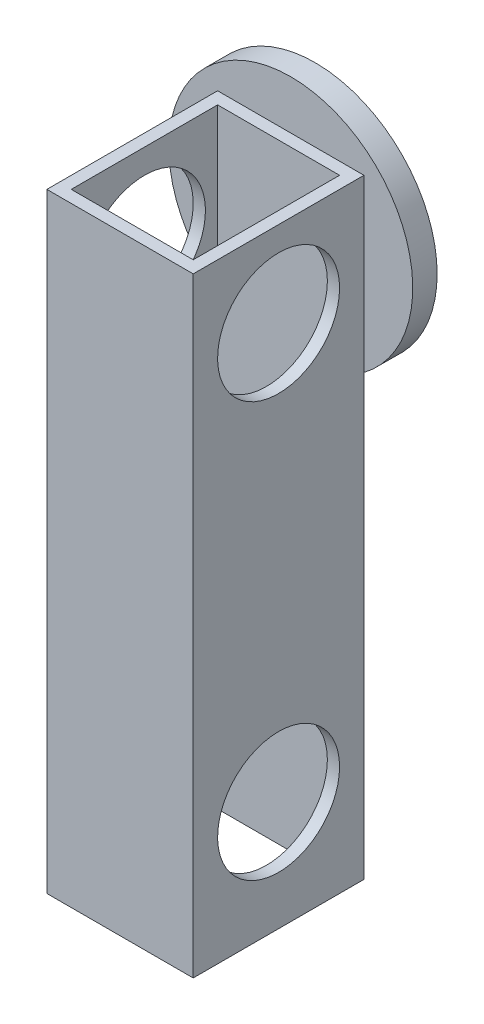
ISO-10303-21;
HEADER;
FILE_DESCRIPTION(('STEP AP214'),'2;1');
FILE_NAME('part.step','',(''),(''),'','','');
FILE_SCHEMA(('AUTOMOTIVE_DESIGN { 1 0 10303 214 1 1 1 1 }'));
ENDSEC;
DATA;
#1=APPLICATION_CONTEXT('core data for automotive mechanical design processes');
#2=APPLICATION_PROTOCOL_DEFINITION('international standard','automotive_design',2000,#1);
#3=PRODUCT_CONTEXT('',#1,'mechanical');
#4=PRODUCT('Part','Part','',(#3));
#5=PRODUCT_RELATED_PRODUCT_CATEGORY('part','',(#4));
#6=PRODUCT_DEFINITION_FORMATION('','',#4);
#7=PRODUCT_DEFINITION_CONTEXT('part definition',#1,'design');
#8=PRODUCT_DEFINITION('design','',#6,#7);
#9=PRODUCT_DEFINITION_SHAPE('','',#8);
#10=(LENGTH_UNIT() NAMED_UNIT(*) SI_UNIT(.MILLI.,.METRE.));
#11=(NAMED_UNIT(*) PLANE_ANGLE_UNIT() SI_UNIT($,.RADIAN.));
#12=(NAMED_UNIT(*) SI_UNIT($,.STERADIAN.) SOLID_ANGLE_UNIT());
#13=UNCERTAINTY_MEASURE_WITH_UNIT(LENGTH_MEASURE(1.E-05),#10,'distance_accuracy_value','');
#14=(GEOMETRIC_REPRESENTATION_CONTEXT(3) GLOBAL_UNCERTAINTY_ASSIGNED_CONTEXT((#13)) GLOBAL_UNIT_ASSIGNED_CONTEXT((#10,
#11,#12)) REPRESENTATION_CONTEXT('',''));
#15=CARTESIAN_POINT('',(0.,0.,0.));
#16=DIRECTION('',(0.,0.,1.));
#17=DIRECTION('',(1.,0.,0.));
#18=AXIS2_PLACEMENT_3D('',#15,#16,#17);
#19=CARTESIAN_POINT('',(160.,-175.,45.));
#20=DIRECTION('',(-1.,0.,0.));
#21=DIRECTION('',(0.,-1.,0.));
#22=AXIS2_PLACEMENT_3D('',#19,#20,#21);
#23=CYLINDRICAL_SURFACE('',#22,25.);
#24=CARTESIAN_POINT('',(-25.,-175.,45.));
#25=DIRECTION('',(-1.,0.,0.));
#26=DIRECTION('',(0.,0.,1.));
#27=AXIS2_PLACEMENT_3D('',#24,#25,#26);
#28=CIRCLE('',#27,25.);
#29=CARTESIAN_POINT('',(-25.,-175.,70.));
#30=VERTEX_POINT('',#29);
#31=EDGE_CURVE('E155',#30,#30,#28,.F.);
#32=ORIENTED_EDGE('',*,*,#31,.T.);
#33=EDGE_LOOP('',(#32));
#34=FACE_BOUND('',#33,.T.);
#35=CARTESIAN_POINT('',(-30.,-175.,45.));
#36=DIRECTION('',(-1.,0.,0.));
#37=DIRECTION('',(0.,-1.,0.));
#38=AXIS2_PLACEMENT_3D('',#35,#36,#37);
#39=CIRCLE('',#38,25.);
#40=CARTESIAN_POINT('',(-30.,-200.,45.));
#41=VERTEX_POINT('',#40);
#42=EDGE_CURVE('E168',#41,#41,#39,.T.);
#43=ORIENTED_EDGE('',*,*,#42,.T.);
#44=EDGE_LOOP('',(#43));
#45=FACE_BOUND('',#44,.T.);
#46=ADVANCED_FACE('F38',(#34,#45),#23,.F.);
#47=CARTESIAN_POINT('',(160.,-4.99999999999998,45.));
#48=DIRECTION('',(-1.,0.,0.));
#49=DIRECTION('',(0.,-1.,0.));
#50=AXIS2_PLACEMENT_3D('',#47,#48,#49);
#51=CYLINDRICAL_SURFACE('',#50,25.);
#52=CARTESIAN_POINT('',(-25.,-5.,45.));
#53=DIRECTION('',(-1.,0.,0.));
#54=DIRECTION('',(0.,0.,1.));
#55=AXIS2_PLACEMENT_3D('',#52,#53,#54);
#56=CIRCLE('',#55,25.);
#57=CARTESIAN_POINT('',(-25.,-5.,70.));
#58=VERTEX_POINT('',#57);
#59=EDGE_CURVE('E42',#58,#58,#56,.F.);
#60=ORIENTED_EDGE('',*,*,#59,.T.);
#61=EDGE_LOOP('',(#60));
#62=FACE_BOUND('',#61,.T.);
#63=CARTESIAN_POINT('',(-30.,-5.,45.));
#64=DIRECTION('',(-1.,0.,0.));
#65=DIRECTION('',(0.,-1.,0.));
#66=AXIS2_PLACEMENT_3D('',#63,#64,#65);
#67=CIRCLE('',#66,25.);
#68=CARTESIAN_POINT('',(-30.,-30.,45.));
#69=VERTEX_POINT('',#68);
#70=EDGE_CURVE('E169',#69,#69,#67,.T.);
#71=ORIENTED_EDGE('',*,*,#70,.T.);
#72=EDGE_LOOP('',(#71));
#73=FACE_BOUND('',#72,.T.);
#74=ADVANCED_FACE('F290',(#62,#73),#51,.F.);
#75=CARTESIAN_POINT('',(0.,0.,10.));
#76=DIRECTION('',(0.,0.,1.));
#77=DIRECTION('',(1.,0.,0.));
#78=AXIS2_PLACEMENT_3D('',#75,#76,#77);
#79=PLANE('',#78);
#80=CARTESIAN_POINT('',(0.,0.,10.));
#81=DIRECTION('',(0.,0.,1.));
#82=DIRECTION('',(1.,0.,0.));
#83=AXIS2_PLACEMENT_3D('',#80,#81,#82);
#84=CIRCLE('',#83,50.);
#85=CARTESIAN_POINT('',(30.,-40.,10.));
#86=VERTEX_POINT('',#85);
#87=CARTESIAN_POINT('',(-30.,-40.,10.));
#88=VERTEX_POINT('',#87);
#89=EDGE_CURVE('E48',#86,#88,#84,.T.);
#90=ORIENTED_EDGE('',*,*,#89,.T.);
#91=DIRECTION('',(0.,-1.,0.));
#92=VECTOR('',#91,1.);
#93=CARTESIAN_POINT('',(-30.,30.,10.));
#94=LINE('',#93,#92);
#95=CARTESIAN_POINT('',(-30.,30.,10.));
#96=VERTEX_POINT('',#95);
#97=EDGE_CURVE('E212',#96,#88,#94,.T.);
#98=ORIENTED_EDGE('',*,*,#97,.F.);
#99=DIRECTION('',(1.,0.,0.));
#100=VECTOR('',#99,1.);
#101=CARTESIAN_POINT('',(-30.,30.,10.));
#102=LINE('',#101,#100);
#103=CARTESIAN_POINT('',(30.,30.,10.));
#104=VERTEX_POINT('',#103);
#105=EDGE_CURVE('E222',#96,#104,#102,.T.);
#106=ORIENTED_EDGE('',*,*,#105,.T.);
#107=DIRECTION('',(0.,-1.,0.));
#108=VECTOR('',#107,1.);
#109=CARTESIAN_POINT('',(30.,30.,10.));
#110=LINE('',#109,#108);
#111=EDGE_CURVE('E207',#104,#86,#110,.T.);
#112=ORIENTED_EDGE('',*,*,#111,.T.);
#113=EDGE_LOOP('',(#90,#98,#106,#112));
#114=FACE_BOUND('',#113,.T.);
#115=ADVANCED_FACE('F271',(#114),#79,.T.);
#116=CARTESIAN_POINT('',(0.,0.,10.));
#117=DIRECTION('',(0.,0.,-1.));
#118=DIRECTION('',(-1.,0.,0.));
#119=AXIS2_PLACEMENT_3D('',#116,#117,#118);
#120=CYLINDRICAL_SURFACE('',#119,50.);
#121=EDGE_CURVE('E11',#88,#86,#84,.T.);
#122=ORIENTED_EDGE('',*,*,#121,.F.);
#123=ORIENTED_EDGE('',*,*,#89,.F.);
#124=EDGE_LOOP('',(#122,#123));
#125=FACE_BOUND('',#124,.T.);
#126=CARTESIAN_POINT('',(0.,0.,0.));
#127=DIRECTION('',(0.,0.,1.));
#128=DIRECTION('',(1.,0.,0.));
#129=AXIS2_PLACEMENT_3D('',#126,#127,#128);
#130=CIRCLE('',#129,50.);
#131=CARTESIAN_POINT('',(50.,0.,0.));
#132=VERTEX_POINT('',#131);
#133=EDGE_CURVE('E232',#132,#132,#130,.T.);
#134=ORIENTED_EDGE('',*,*,#133,.T.);
#135=EDGE_LOOP('',(#134));
#136=FACE_BOUND('',#135,.T.);
#137=ADVANCED_FACE('F40',(#125,#136),#120,.T.);
#138=CARTESIAN_POINT('',(0.,0.,0.));
#139=DIRECTION('',(0.,0.,1.));
#140=DIRECTION('',(1.,0.,0.));
#141=AXIS2_PLACEMENT_3D('',#138,#139,#140);
#142=PLANE('',#141);
#143=ORIENTED_EDGE('',*,*,#133,.F.);
#144=EDGE_LOOP('',(#143));
#145=FACE_BOUND('',#144,.T.);
#146=ADVANCED_FACE('F259',(#145),#142,.F.);
#147=CARTESIAN_POINT('',(30.,30.,80.));
#148=DIRECTION('',(1.,0.,0.));
#149=DIRECTION('',(0.,1.,0.));
#150=AXIS2_PLACEMENT_3D('',#147,#148,#149);
#151=PLANE('',#150);
#152=CARTESIAN_POINT('',(30.,-4.99999999999999,45.));
#153=DIRECTION('',(1.,0.,0.));
#154=DIRECTION('',(0.,1.,0.));
#155=AXIS2_PLACEMENT_3D('',#152,#153,#154);
#156=CIRCLE('',#155,25.);
#157=CARTESIAN_POINT('',(30.,20.,45.));
#158=VERTEX_POINT('',#157);
#159=EDGE_CURVE('E180',#158,#158,#156,.T.);
#160=ORIENTED_EDGE('',*,*,#159,.F.);
#161=EDGE_LOOP('',(#160));
#162=FACE_BOUND('',#161,.T.);
#163=CARTESIAN_POINT('',(30.,-175.,45.));
#164=DIRECTION('',(1.,0.,0.));
#165=DIRECTION('',(0.,1.,0.));
#166=AXIS2_PLACEMENT_3D('',#163,#164,#165);
#167=CIRCLE('',#166,25.);
#168=CARTESIAN_POINT('',(30.,-150.,45.));
#169=VERTEX_POINT('',#168);
#170=EDGE_CURVE('E173',#169,#169,#167,.T.);
#171=ORIENTED_EDGE('',*,*,#170,.F.);
#172=EDGE_LOOP('',(#171));
#173=FACE_BOUND('',#172,.T.);
#174=ORIENTED_EDGE('',*,*,#111,.F.);
#175=DIRECTION('',(0.,0.,-1.));
#176=VECTOR('',#175,1.);
#177=CARTESIAN_POINT('',(30.,30.,80.));
#178=LINE('',#177,#176);
#179=CARTESIAN_POINT('',(30.,30.,80.));
#180=VERTEX_POINT('',#179);
#181=EDGE_CURVE('E230',#180,#104,#178,.T.);
#182=ORIENTED_EDGE('',*,*,#181,.F.);
#183=DIRECTION('',(0.,-1.,0.));
#184=VECTOR('',#183,1.);
#185=CARTESIAN_POINT('',(30.,30.,80.));
#186=LINE('',#185,#184);
#187=CARTESIAN_POINT('',(30.,-220.,80.));
#188=VERTEX_POINT('',#187);
#189=EDGE_CURVE('E208',#180,#188,#186,.T.);
#190=ORIENTED_EDGE('',*,*,#189,.T.);
#191=DIRECTION('',(0.,0.,1.));
#192=VECTOR('',#191,1.);
#193=CARTESIAN_POINT('',(30.,-220.,80.));
#194=LINE('',#193,#192);
#195=CARTESIAN_POINT('',(30.,-220.,10.));
#196=VERTEX_POINT('',#195);
#197=EDGE_CURVE('E191',#196,#188,#194,.T.);
#198=ORIENTED_EDGE('',*,*,#197,.F.);
#199=DIRECTION('',(0.,1.,0.));
#200=VECTOR('',#199,1.);
#201=CARTESIAN_POINT('',(30.,-220.,10.));
#202=LINE('',#201,#200);
#203=EDGE_CURVE('E199',#196,#86,#202,.T.);
#204=ORIENTED_EDGE('',*,*,#203,.T.);
#205=EDGE_LOOP('',(#174,#182,#190,#198,#204));
#206=FACE_BOUND('',#205,.T.);
#207=ADVANCED_FACE('F255',(#162,#173,#206),#151,.T.);
#208=CARTESIAN_POINT('',(-30.,30.,80.));
#209=DIRECTION('',(0.,1.,0.));
#210=DIRECTION('',(0.,0.,1.));
#211=AXIS2_PLACEMENT_3D('',#208,#209,#210);
#212=PLANE('',#211);
#213=DIRECTION('',(0.,0.,1.));
#214=VECTOR('',#213,1.);
#215=CARTESIAN_POINT('',(-25.,30.,80.));
#216=LINE('',#215,#214);
#217=CARTESIAN_POINT('',(-25.,30.,15.));
#218=VERTEX_POINT('',#217);
#219=CARTESIAN_POINT('',(-25.,30.,75.));
#220=VERTEX_POINT('',#219);
#221=EDGE_CURVE('E159',#218,#220,#216,.T.);
#222=ORIENTED_EDGE('',*,*,#221,.F.);
#223=DIRECTION('',(-1.,0.,0.));
#224=VECTOR('',#223,1.);
#225=CARTESIAN_POINT('',(-30.,30.,15.));
#226=LINE('',#225,#224);
#227=CARTESIAN_POINT('',(25.,30.,15.));
#228=VERTEX_POINT('',#227);
#229=EDGE_CURVE('E162',#228,#218,#226,.T.);
#230=ORIENTED_EDGE('',*,*,#229,.F.);
#231=DIRECTION('',(0.,0.,-1.));
#232=VECTOR('',#231,1.);
#233=CARTESIAN_POINT('',(25.,30.,80.));
#234=LINE('',#233,#232);
#235=CARTESIAN_POINT('',(25.,30.,75.));
#236=VERTEX_POINT('',#235);
#237=EDGE_CURVE('E119',#236,#228,#234,.T.);
#238=ORIENTED_EDGE('',*,*,#237,.F.);
#239=DIRECTION('',(1.,0.,0.));
#240=VECTOR('',#239,1.);
#241=CARTESIAN_POINT('',(-30.,30.,75.));
#242=LINE('',#241,#240);
#243=EDGE_CURVE('E165',#220,#236,#242,.T.);
#244=ORIENTED_EDGE('',*,*,#243,.F.);
#245=EDGE_LOOP('',(#222,#230,#238,#244));
#246=FACE_BOUND('',#245,.T.);
#247=ORIENTED_EDGE('',*,*,#105,.F.);
#248=DIRECTION('',(0.,0.,-1.));
#249=VECTOR('',#248,1.);
#250=CARTESIAN_POINT('',(-30.,30.,80.));
#251=LINE('',#250,#249);
#252=CARTESIAN_POINT('',(-30.,30.,80.));
#253=VERTEX_POINT('',#252);
#254=EDGE_CURVE('E219',#253,#96,#251,.T.);
#255=ORIENTED_EDGE('',*,*,#254,.F.);
#256=DIRECTION('',(1.,0.,0.));
#257=VECTOR('',#256,1.);
#258=CARTESIAN_POINT('',(-30.,30.,80.));
#259=LINE('',#258,#257);
#260=EDGE_CURVE('E211',#253,#180,#259,.T.);
#261=ORIENTED_EDGE('',*,*,#260,.T.);
#262=ORIENTED_EDGE('',*,*,#181,.T.);
#263=EDGE_LOOP('',(#247,#255,#261,#262));
#264=FACE_BOUND('',#263,.T.);
#265=ADVANCED_FACE('F258',(#246,#264),#212,.T.);
#266=CARTESIAN_POINT('',(-30.,30.,80.));
#267=DIRECTION('',(1.,0.,0.));
#268=DIRECTION('',(0.,1.,0.));
#269=AXIS2_PLACEMENT_3D('',#266,#267,#268);
#270=PLANE('',#269);
#271=ORIENTED_EDGE('',*,*,#70,.F.);
#272=EDGE_LOOP('',(#271));
#273=FACE_BOUND('',#272,.T.);
#274=ORIENTED_EDGE('',*,*,#42,.F.);
#275=EDGE_LOOP('',(#274));
#276=FACE_BOUND('',#275,.T.);
#277=ORIENTED_EDGE('',*,*,#97,.T.);
#278=DIRECTION('',(0.,1.,0.));
#279=VECTOR('',#278,1.);
#280=CARTESIAN_POINT('',(-30.,-220.,10.));
#281=LINE('',#280,#279);
#282=CARTESIAN_POINT('',(-30.,-220.,10.));
#283=VERTEX_POINT('',#282);
#284=EDGE_CURVE('E203',#283,#88,#281,.T.);
#285=ORIENTED_EDGE('',*,*,#284,.F.);
#286=DIRECTION('',(0.,0.,-1.));
#287=VECTOR('',#286,1.);
#288=CARTESIAN_POINT('',(-30.,-220.,80.));
#289=LINE('',#288,#287);
#290=CARTESIAN_POINT('',(-30.,-220.,80.));
#291=VERTEX_POINT('',#290);
#292=EDGE_CURVE('E184',#291,#283,#289,.T.);
#293=ORIENTED_EDGE('',*,*,#292,.F.);
#294=DIRECTION('',(0.,-1.,0.));
#295=VECTOR('',#294,1.);
#296=CARTESIAN_POINT('',(-30.,30.,80.));
#297=LINE('',#296,#295);
#298=EDGE_CURVE('E216',#253,#291,#297,.T.);
#299=ORIENTED_EDGE('',*,*,#298,.F.);
#300=ORIENTED_EDGE('',*,*,#254,.T.);
#301=EDGE_LOOP('',(#277,#285,#293,#299,#300));
#302=FACE_BOUND('',#301,.T.);
#303=ADVANCED_FACE('F302',(#273,#276,#302),#270,.F.);
#304=CARTESIAN_POINT('',(0.,0.,80.));
#305=DIRECTION('',(0.,0.,-1.));
#306=DIRECTION('',(-1.,0.,0.));
#307=AXIS2_PLACEMENT_3D('',#304,#305,#306);
#308=PLANE('',#307);
#309=ORIENTED_EDGE('',*,*,#298,.T.);
#310=DIRECTION('',(-1.,0.,0.));
#311=VECTOR('',#310,1.);
#312=CARTESIAN_POINT('',(-30.,-220.,80.));
#313=LINE('',#312,#311);
#314=EDGE_CURVE('E195',#188,#291,#313,.T.);
#315=ORIENTED_EDGE('',*,*,#314,.F.);
#316=ORIENTED_EDGE('',*,*,#189,.F.);
#317=ORIENTED_EDGE('',*,*,#260,.F.);
#318=EDGE_LOOP('',(#309,#315,#316,#317));
#319=FACE_BOUND('',#318,.T.);
#320=ADVANCED_FACE('F276',(#319),#308,.F.);
#321=CARTESIAN_POINT('',(-30.,-220.,10.));
#322=DIRECTION('',(0.,0.,1.));
#323=DIRECTION('',(1.,0.,0.));
#324=AXIS2_PLACEMENT_3D('',#321,#322,#323);
#325=PLANE('',#324);
#326=ORIENTED_EDGE('',*,*,#284,.T.);
#327=ORIENTED_EDGE('',*,*,#121,.T.);
#328=ORIENTED_EDGE('',*,*,#203,.F.);
#329=DIRECTION('',(1.,0.,0.));
#330=VECTOR('',#329,1.);
#331=CARTESIAN_POINT('',(-30.,-220.,10.));
#332=LINE('',#331,#330);
#333=EDGE_CURVE('E188',#283,#196,#332,.T.);
#334=ORIENTED_EDGE('',*,*,#333,.F.);
#335=EDGE_LOOP('',(#326,#327,#328,#334));
#336=FACE_BOUND('',#335,.T.);
#337=ADVANCED_FACE('F281',(#336),#325,.F.);
#338=CARTESIAN_POINT('',(0.,-220.,0.));
#339=DIRECTION('',(0.,-1.,0.));
#340=DIRECTION('',(0.,0.,-1.));
#341=AXIS2_PLACEMENT_3D('',#338,#339,#340);
#342=PLANE('',#341);
#343=DIRECTION('',(0.,0.,-1.));
#344=VECTOR('',#343,1.);
#345=CARTESIAN_POINT('',(-25.,-220.,75.));
#346=LINE('',#345,#344);
#347=CARTESIAN_POINT('',(-25.,-220.,75.));
#348=VERTEX_POINT('',#347);
#349=CARTESIAN_POINT('',(-25.,-220.,15.));
#350=VERTEX_POINT('',#349);
#351=EDGE_CURVE('E64',#348,#350,#346,.T.);
#352=ORIENTED_EDGE('',*,*,#351,.F.);
#353=DIRECTION('',(-1.,0.,0.));
#354=VECTOR('',#353,1.);
#355=CARTESIAN_POINT('',(-25.,-220.,75.));
#356=LINE('',#355,#354);
#357=CARTESIAN_POINT('',(25.,-220.,75.));
#358=VERTEX_POINT('',#357);
#359=EDGE_CURVE('E134',#358,#348,#356,.T.);
#360=ORIENTED_EDGE('',*,*,#359,.F.);
#361=DIRECTION('',(0.,0.,1.));
#362=VECTOR('',#361,1.);
#363=CARTESIAN_POINT('',(25.,-220.,75.));
#364=LINE('',#363,#362);
#365=CARTESIAN_POINT('',(25.,-220.,15.));
#366=VERTEX_POINT('',#365);
#367=EDGE_CURVE('E116',#366,#358,#364,.T.);
#368=ORIENTED_EDGE('',*,*,#367,.F.);
#369=DIRECTION('',(1.,0.,0.));
#370=VECTOR('',#369,1.);
#371=CARTESIAN_POINT('',(-25.,-220.,15.));
#372=LINE('',#371,#370);
#373=EDGE_CURVE('E126',#350,#366,#372,.T.);
#374=ORIENTED_EDGE('',*,*,#373,.F.);
#375=EDGE_LOOP('',(#352,#360,#368,#374));
#376=FACE_BOUND('',#375,.T.);
#377=ORIENTED_EDGE('',*,*,#292,.T.);
#378=ORIENTED_EDGE('',*,*,#333,.T.);
#379=ORIENTED_EDGE('',*,*,#197,.T.);
#380=ORIENTED_EDGE('',*,*,#314,.T.);
#381=EDGE_LOOP('',(#377,#378,#379,#380));
#382=FACE_BOUND('',#381,.T.);
#383=ADVANCED_FACE('F131',(#376,#382),#342,.T.);
#384=CARTESIAN_POINT('',(25.,-175.,45.));
#385=DIRECTION('',(1.,0.,0.));
#386=DIRECTION('',(0.,0.,-1.));
#387=AXIS2_PLACEMENT_3D('',#384,#385,#386);
#388=CIRCLE('',#387,25.);
#389=CARTESIAN_POINT('',(25.,-175.,20.));
#390=VERTEX_POINT('',#389);
#391=EDGE_CURVE('E149',#390,#390,#388,.F.);
#392=ORIENTED_EDGE('',*,*,#391,.T.);
#393=EDGE_LOOP('',(#392));
#394=FACE_BOUND('',#393,.T.);
#395=ORIENTED_EDGE('',*,*,#170,.T.);
#396=EDGE_LOOP('',(#395));
#397=FACE_BOUND('',#396,.T.);
#398=ADVANCED_FACE('F249',(#394,#397),#23,.F.);
#399=CARTESIAN_POINT('',(25.,-4.99999999999999,45.));
#400=DIRECTION('',(1.,0.,0.));
#401=DIRECTION('',(0.,0.,-1.));
#402=AXIS2_PLACEMENT_3D('',#399,#400,#401);
#403=CIRCLE('',#402,25.);
#404=CARTESIAN_POINT('',(25.,-4.99999999999999,20.));
#405=VERTEX_POINT('',#404);
#406=EDGE_CURVE('E144',#405,#405,#403,.F.);
#407=ORIENTED_EDGE('',*,*,#406,.T.);
#408=EDGE_LOOP('',(#407));
#409=FACE_BOUND('',#408,.T.);
#410=ORIENTED_EDGE('',*,*,#159,.T.);
#411=EDGE_LOOP('',(#410));
#412=FACE_BOUND('',#411,.T.);
#413=ADVANCED_FACE('F240',(#409,#412),#51,.F.);
#414=CARTESIAN_POINT('',(-25.,50.,75.));
#415=DIRECTION('',(-1.,0.,0.));
#416=DIRECTION('',(0.,0.,1.));
#417=AXIS2_PLACEMENT_3D('',#414,#415,#416);
#418=PLANE('',#417);
#419=ORIENTED_EDGE('',*,*,#221,.T.);
#420=DIRECTION('',(0.,-1.,0.));
#421=VECTOR('',#420,1.);
#422=CARTESIAN_POINT('',(-25.,50.,75.));
#423=LINE('',#422,#421);
#424=EDGE_CURVE('E141',#220,#348,#423,.T.);
#425=ORIENTED_EDGE('',*,*,#424,.T.);
#426=ORIENTED_EDGE('',*,*,#351,.T.);
#427=DIRECTION('',(0.,-1.,0.));
#428=VECTOR('',#427,1.);
#429=CARTESIAN_POINT('',(-25.,50.,15.));
#430=LINE('',#429,#428);
#431=EDGE_CURVE('E123',#218,#350,#430,.T.);
#432=ORIENTED_EDGE('',*,*,#431,.F.);
#433=EDGE_LOOP('',(#419,#425,#426,#432));
#434=FACE_BOUND('',#433,.T.);
#435=ORIENTED_EDGE('',*,*,#59,.F.);
#436=EDGE_LOOP('',(#435));
#437=FACE_BOUND('',#436,.T.);
#438=ORIENTED_EDGE('',*,*,#31,.F.);
#439=EDGE_LOOP('',(#438));
#440=FACE_BOUND('',#439,.T.);
#441=ADVANCED_FACE('F245',(#434,#437,#440),#418,.F.);
#442=CARTESIAN_POINT('',(25.,50.,75.));
#443=DIRECTION('',(1.,0.,0.));
#444=DIRECTION('',(0.,0.,-1.));
#445=AXIS2_PLACEMENT_3D('',#442,#443,#444);
#446=PLANE('',#445);
#447=ORIENTED_EDGE('',*,*,#237,.T.);
#448=DIRECTION('',(0.,-1.,0.));
#449=VECTOR('',#448,1.);
#450=CARTESIAN_POINT('',(25.,50.,15.));
#451=LINE('',#450,#449);
#452=EDGE_CURVE('E56',#228,#366,#451,.T.);
#453=ORIENTED_EDGE('',*,*,#452,.T.);
#454=ORIENTED_EDGE('',*,*,#367,.T.);
#455=DIRECTION('',(0.,-1.,0.));
#456=VECTOR('',#455,1.);
#457=CARTESIAN_POINT('',(25.,50.,75.));
#458=LINE('',#457,#456);
#459=EDGE_CURVE('E122',#236,#358,#458,.T.);
#460=ORIENTED_EDGE('',*,*,#459,.F.);
#461=EDGE_LOOP('',(#447,#453,#454,#460));
#462=FACE_BOUND('',#461,.T.);
#463=ORIENTED_EDGE('',*,*,#406,.F.);
#464=EDGE_LOOP('',(#463));
#465=FACE_BOUND('',#464,.T.);
#466=ORIENTED_EDGE('',*,*,#391,.F.);
#467=EDGE_LOOP('',(#466));
#468=FACE_BOUND('',#467,.T.);
#469=ADVANCED_FACE('F112',(#462,#465,#468),#446,.F.);
#470=CARTESIAN_POINT('',(-25.,50.,75.));
#471=DIRECTION('',(0.,0.,1.));
#472=DIRECTION('',(1.,0.,0.));
#473=AXIS2_PLACEMENT_3D('',#470,#471,#472);
#474=PLANE('',#473);
#475=ORIENTED_EDGE('',*,*,#243,.T.);
#476=ORIENTED_EDGE('',*,*,#459,.T.);
#477=ORIENTED_EDGE('',*,*,#359,.T.);
#478=ORIENTED_EDGE('',*,*,#424,.F.);
#479=EDGE_LOOP('',(#475,#476,#477,#478));
#480=FACE_BOUND('',#479,.T.);
#481=ADVANCED_FACE('F244',(#480),#474,.F.);
#482=CARTESIAN_POINT('',(-25.,50.,15.));
#483=DIRECTION('',(0.,0.,-1.));
#484=DIRECTION('',(-1.,0.,0.));
#485=AXIS2_PLACEMENT_3D('',#482,#483,#484);
#486=PLANE('',#485);
#487=ORIENTED_EDGE('',*,*,#229,.T.);
#488=ORIENTED_EDGE('',*,*,#431,.T.);
#489=ORIENTED_EDGE('',*,*,#373,.T.);
#490=ORIENTED_EDGE('',*,*,#452,.F.);
#491=EDGE_LOOP('',(#487,#488,#489,#490));
#492=FACE_BOUND('',#491,.T.);
#493=ADVANCED_FACE('F127',(#492),#486,.F.);
#494=CLOSED_SHELL('',(#46,#74,#115,#137,#146,#207,#265,#303,#320,#337,#383,#398,#413,#441,#469,
#481,#493));
#495=MANIFOLD_SOLID_BREP('B2',#494);
#496=ADVANCED_BREP_SHAPE_REPRESENTATION('',(#18,#495),#14);
#497=SHAPE_DEFINITION_REPRESENTATION(#9,#496);
ENDSEC;
END-ISO-10303-21;
